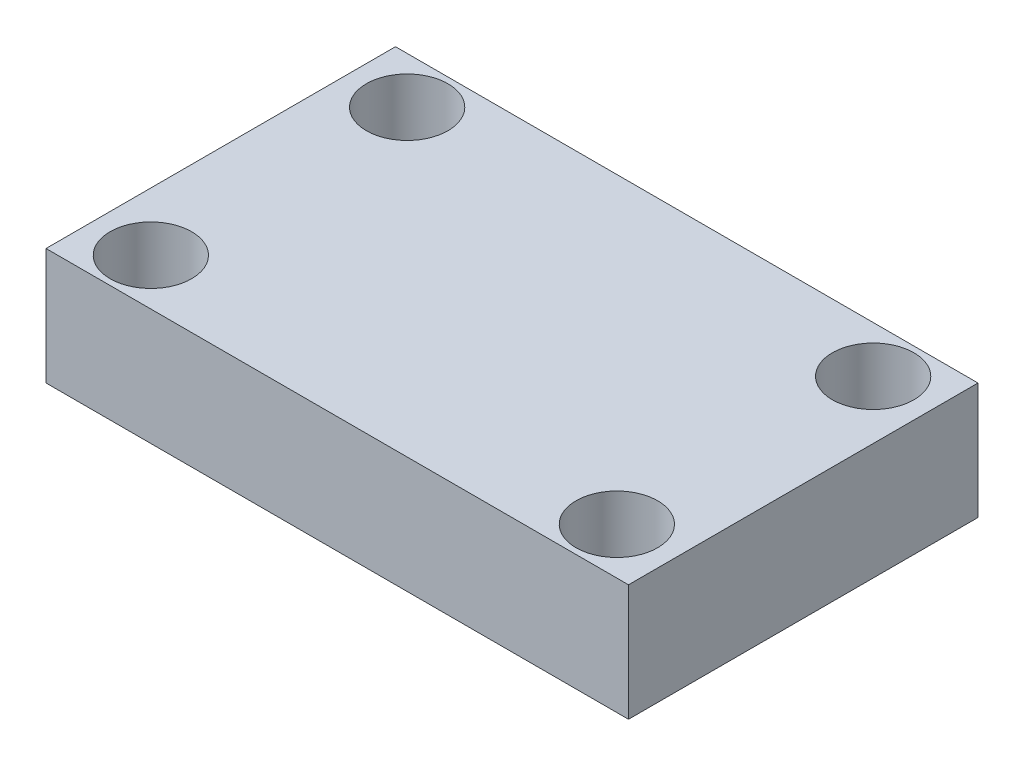
ISO-10303-21;
HEADER;
FILE_DESCRIPTION(('STEP AP214'),'2;1');
FILE_NAME('part.step','',(''),(''),'','','');
FILE_SCHEMA(('AUTOMOTIVE_DESIGN { 1 0 10303 214 1 1 1 1 }'));
ENDSEC;
DATA;
#1=APPLICATION_CONTEXT('core data for automotive mechanical design processes');
#2=APPLICATION_PROTOCOL_DEFINITION('international standard','automotive_design',2000,#1);
#3=PRODUCT_CONTEXT('',#1,'mechanical');
#4=PRODUCT('Part','Part','',(#3));
#5=PRODUCT_RELATED_PRODUCT_CATEGORY('part','',(#4));
#6=PRODUCT_DEFINITION_FORMATION('','',#4);
#7=PRODUCT_DEFINITION_CONTEXT('part definition',#1,'design');
#8=PRODUCT_DEFINITION('design','',#6,#7);
#9=PRODUCT_DEFINITION_SHAPE('','',#8);
#10=(LENGTH_UNIT() NAMED_UNIT(*) SI_UNIT(.MILLI.,.METRE.));
#11=(NAMED_UNIT(*) PLANE_ANGLE_UNIT() SI_UNIT($,.RADIAN.));
#12=(NAMED_UNIT(*) SI_UNIT($,.STERADIAN.) SOLID_ANGLE_UNIT());
#13=UNCERTAINTY_MEASURE_WITH_UNIT(LENGTH_MEASURE(1.E-05),#10,'distance_accuracy_value','');
#14=(GEOMETRIC_REPRESENTATION_CONTEXT(3) GLOBAL_UNCERTAINTY_ASSIGNED_CONTEXT((#13)) GLOBAL_UNIT_ASSIGNED_CONTEXT((#10,
#11,#12)) REPRESENTATION_CONTEXT('',''));
#15=CARTESIAN_POINT('',(0.,0.,0.));
#16=DIRECTION('',(0.,0.,1.));
#17=DIRECTION('',(1.,0.,0.));
#18=AXIS2_PLACEMENT_3D('',#15,#16,#17);
#19=CARTESIAN_POINT('',(-250.,100.,150.));
#20=DIRECTION('',(1.,0.,0.));
#21=DIRECTION('',(0.,0.,-1.));
#22=AXIS2_PLACEMENT_3D('',#19,#20,#21);
#23=PLANE('',#22);
#24=DIRECTION('',(0.,0.,1.));
#25=VECTOR('',#24,1.);
#26=CARTESIAN_POINT('',(-250.,0.,150.));
#27=LINE('',#26,#25);
#28=CARTESIAN_POINT('',(-250.,0.,-150.));
#29=VERTEX_POINT('',#28);
#30=CARTESIAN_POINT('',(-250.,0.,150.));
#31=VERTEX_POINT('',#30);
#32=EDGE_CURVE('E100',#29,#31,#27,.T.);
#33=ORIENTED_EDGE('',*,*,#32,.T.);
#34=DIRECTION('',(0.,-1.,0.));
#35=VECTOR('',#34,1.);
#36=CARTESIAN_POINT('',(-250.,100.,150.));
#37=LINE('',#36,#35);
#38=CARTESIAN_POINT('',(-250.,100.,150.));
#39=VERTEX_POINT('',#38);
#40=EDGE_CURVE('E11',#39,#31,#37,.T.);
#41=ORIENTED_EDGE('',*,*,#40,.F.);
#42=DIRECTION('',(0.,0.,1.));
#43=VECTOR('',#42,1.);
#44=CARTESIAN_POINT('',(-250.,100.,150.));
#45=LINE('',#44,#43);
#46=CARTESIAN_POINT('',(-250.,100.,-150.));
#47=VERTEX_POINT('',#46);
#48=EDGE_CURVE('E88',#47,#39,#45,.T.);
#49=ORIENTED_EDGE('',*,*,#48,.F.);
#50=DIRECTION('',(0.,-1.,0.));
#51=VECTOR('',#50,1.);
#52=CARTESIAN_POINT('',(-250.,100.,-150.));
#53=LINE('',#52,#51);
#54=EDGE_CURVE('E96',#47,#29,#53,.T.);
#55=ORIENTED_EDGE('',*,*,#54,.T.);
#56=EDGE_LOOP('',(#33,#41,#49,#55));
#57=FACE_BOUND('',#56,.T.);
#58=ADVANCED_FACE('F37',(#57),#23,.F.);
#59=CARTESIAN_POINT('',(250.,100.,150.));
#60=DIRECTION('',(0.,0.,-1.));
#61=DIRECTION('',(-1.,0.,0.));
#62=AXIS2_PLACEMENT_3D('',#59,#60,#61);
#63=PLANE('',#62);
#64=DIRECTION('',(1.,0.,0.));
#65=VECTOR('',#64,1.);
#66=CARTESIAN_POINT('',(250.,0.,150.));
#67=LINE('',#66,#65);
#68=CARTESIAN_POINT('',(250.,0.,150.));
#69=VERTEX_POINT('',#68);
#70=EDGE_CURVE('E92',#31,#69,#67,.T.);
#71=ORIENTED_EDGE('',*,*,#70,.T.);
#72=DIRECTION('',(0.,-1.,0.));
#73=VECTOR('',#72,1.);
#74=CARTESIAN_POINT('',(250.,100.,150.));
#75=LINE('',#74,#73);
#76=CARTESIAN_POINT('',(250.,100.,150.));
#77=VERTEX_POINT('',#76);
#78=EDGE_CURVE('E45',#77,#69,#75,.T.);
#79=ORIENTED_EDGE('',*,*,#78,.F.);
#80=DIRECTION('',(1.,0.,0.));
#81=VECTOR('',#80,1.);
#82=CARTESIAN_POINT('',(250.,100.,150.));
#83=LINE('',#82,#81);
#84=EDGE_CURVE('E83',#39,#77,#83,.T.);
#85=ORIENTED_EDGE('',*,*,#84,.F.);
#86=ORIENTED_EDGE('',*,*,#40,.T.);
#87=EDGE_LOOP('',(#71,#79,#85,#86));
#88=FACE_BOUND('',#87,.T.);
#89=ADVANCED_FACE('F91',(#88),#63,.F.);
#90=CARTESIAN_POINT('',(250.,100.,150.));
#91=DIRECTION('',(-1.,0.,0.));
#92=DIRECTION('',(0.,0.,1.));
#93=AXIS2_PLACEMENT_3D('',#90,#91,#92);
#94=PLANE('',#93);
#95=DIRECTION('',(0.,0.,-1.));
#96=VECTOR('',#95,1.);
#97=CARTESIAN_POINT('',(250.,0.,150.));
#98=LINE('',#97,#96);
#99=CARTESIAN_POINT('',(250.,0.,-150.));
#100=VERTEX_POINT('',#99);
#101=EDGE_CURVE('E70',#69,#100,#98,.T.);
#102=ORIENTED_EDGE('',*,*,#101,.T.);
#103=DIRECTION('',(0.,-1.,0.));
#104=VECTOR('',#103,1.);
#105=CARTESIAN_POINT('',(250.,100.,-150.));
#106=LINE('',#105,#104);
#107=CARTESIAN_POINT('',(250.,100.,-150.));
#108=VERTEX_POINT('',#107);
#109=EDGE_CURVE('E93',#108,#100,#106,.T.);
#110=ORIENTED_EDGE('',*,*,#109,.F.);
#111=DIRECTION('',(0.,0.,-1.));
#112=VECTOR('',#111,1.);
#113=CARTESIAN_POINT('',(250.,100.,150.));
#114=LINE('',#113,#112);
#115=EDGE_CURVE('E86',#77,#108,#114,.T.);
#116=ORIENTED_EDGE('',*,*,#115,.F.);
#117=ORIENTED_EDGE('',*,*,#78,.T.);
#118=EDGE_LOOP('',(#102,#110,#116,#117));
#119=FACE_BOUND('',#118,.T.);
#120=ADVANCED_FACE('F94',(#119),#94,.F.);
#121=CARTESIAN_POINT('',(250.,100.,-150.));
#122=DIRECTION('',(0.,0.,1.));
#123=DIRECTION('',(1.,0.,0.));
#124=AXIS2_PLACEMENT_3D('',#121,#122,#123);
#125=PLANE('',#124);
#126=DIRECTION('',(-1.,0.,0.));
#127=VECTOR('',#126,1.);
#128=CARTESIAN_POINT('',(250.,0.,-150.));
#129=LINE('',#128,#127);
#130=EDGE_CURVE('E76',#100,#29,#129,.T.);
#131=ORIENTED_EDGE('',*,*,#130,.T.);
#132=ORIENTED_EDGE('',*,*,#54,.F.);
#133=DIRECTION('',(-1.,0.,0.));
#134=VECTOR('',#133,1.);
#135=CARTESIAN_POINT('',(250.,100.,-150.));
#136=LINE('',#135,#134);
#137=EDGE_CURVE('E53',#108,#47,#136,.T.);
#138=ORIENTED_EDGE('',*,*,#137,.F.);
#139=ORIENTED_EDGE('',*,*,#109,.T.);
#140=EDGE_LOOP('',(#131,#132,#138,#139));
#141=FACE_BOUND('',#140,.T.);
#142=ADVANCED_FACE('F108',(#141),#125,.F.);
#143=CARTESIAN_POINT('',(0.,100.,0.));
#144=DIRECTION('',(0.,1.,0.));
#145=DIRECTION('',(0.,0.,1.));
#146=AXIS2_PLACEMENT_3D('',#143,#144,#145);
#147=PLANE('',#146);
#148=CARTESIAN_POINT('',(-200.,100.,110.));
#149=DIRECTION('',(0.,1.,0.));
#150=DIRECTION('',(0.,0.,1.));
#151=AXIS2_PLACEMENT_3D('',#148,#149,#150);
#152=CIRCLE('',#151,35.);
#153=CARTESIAN_POINT('',(-200.,100.,145.));
#154=VERTEX_POINT('',#153);
#155=EDGE_CURVE('E120',#154,#154,#152,.T.);
#156=ORIENTED_EDGE('',*,*,#155,.F.);
#157=EDGE_LOOP('',(#156));
#158=FACE_BOUND('',#157,.T.);
#159=CARTESIAN_POINT('',(200.,100.,110.));
#160=DIRECTION('',(0.,1.,0.));
#161=DIRECTION('',(0.,0.,1.));
#162=AXIS2_PLACEMENT_3D('',#159,#160,#161);
#163=CIRCLE('',#162,35.);
#164=CARTESIAN_POINT('',(200.,100.,145.));
#165=VERTEX_POINT('',#164);
#166=EDGE_CURVE('E126',#165,#165,#163,.T.);
#167=ORIENTED_EDGE('',*,*,#166,.F.);
#168=EDGE_LOOP('',(#167));
#169=FACE_BOUND('',#168,.T.);
#170=CARTESIAN_POINT('',(200.,100.,-110.));
#171=DIRECTION('',(0.,1.,0.));
#172=DIRECTION('',(0.,0.,1.));
#173=AXIS2_PLACEMENT_3D('',#170,#171,#172);
#174=CIRCLE('',#173,35.);
#175=CARTESIAN_POINT('',(200.,100.,-75.));
#176=VERTEX_POINT('',#175);
#177=EDGE_CURVE('E132',#176,#176,#174,.T.);
#178=ORIENTED_EDGE('',*,*,#177,.F.);
#179=EDGE_LOOP('',(#178));
#180=FACE_BOUND('',#179,.T.);
#181=CARTESIAN_POINT('',(-200.,100.,-110.));
#182=DIRECTION('',(0.,1.,0.));
#183=DIRECTION('',(0.,0.,1.));
#184=AXIS2_PLACEMENT_3D('',#181,#182,#183);
#185=CIRCLE('',#184,35.);
#186=CARTESIAN_POINT('',(-200.,100.,-75.));
#187=VERTEX_POINT('',#186);
#188=EDGE_CURVE('E103',#187,#187,#185,.T.);
#189=ORIENTED_EDGE('',*,*,#188,.F.);
#190=EDGE_LOOP('',(#189));
#191=FACE_BOUND('',#190,.T.);
#192=ORIENTED_EDGE('',*,*,#48,.T.);
#193=ORIENTED_EDGE('',*,*,#84,.T.);
#194=ORIENTED_EDGE('',*,*,#115,.T.);
#195=ORIENTED_EDGE('',*,*,#137,.T.);
#196=EDGE_LOOP('',(#192,#193,#194,#195));
#197=FACE_BOUND('',#196,.T.);
#198=ADVANCED_FACE('F84',(#158,#169,#180,#191,#197),#147,.T.);
#199=CARTESIAN_POINT('',(0.,0.,0.));
#200=DIRECTION('',(0.,1.,0.));
#201=DIRECTION('',(0.,0.,1.));
#202=AXIS2_PLACEMENT_3D('',#199,#200,#201);
#203=PLANE('',#202);
#204=CARTESIAN_POINT('',(-200.,0.,110.));
#205=DIRECTION('',(0.,1.,0.));
#206=DIRECTION('',(0.,0.,1.));
#207=AXIS2_PLACEMENT_3D('',#204,#205,#206);
#208=CIRCLE('',#207,35.);
#209=CARTESIAN_POINT('',(-200.,0.,145.));
#210=VERTEX_POINT('',#209);
#211=EDGE_CURVE('E123',#210,#210,#208,.T.);
#212=ORIENTED_EDGE('',*,*,#211,.T.);
#213=EDGE_LOOP('',(#212));
#214=FACE_BOUND('',#213,.T.);
#215=CARTESIAN_POINT('',(200.,0.,110.));
#216=DIRECTION('',(0.,1.,0.));
#217=DIRECTION('',(0.,0.,1.));
#218=AXIS2_PLACEMENT_3D('',#215,#216,#217);
#219=CIRCLE('',#218,35.);
#220=CARTESIAN_POINT('',(200.,0.,145.));
#221=VERTEX_POINT('',#220);
#222=EDGE_CURVE('E129',#221,#221,#219,.T.);
#223=ORIENTED_EDGE('',*,*,#222,.T.);
#224=EDGE_LOOP('',(#223));
#225=FACE_BOUND('',#224,.T.);
#226=CARTESIAN_POINT('',(200.,0.,-110.));
#227=DIRECTION('',(0.,1.,0.));
#228=DIRECTION('',(0.,0.,1.));
#229=AXIS2_PLACEMENT_3D('',#226,#227,#228);
#230=CIRCLE('',#229,35.);
#231=CARTESIAN_POINT('',(200.,0.,-75.));
#232=VERTEX_POINT('',#231);
#233=EDGE_CURVE('E117',#232,#232,#230,.T.);
#234=ORIENTED_EDGE('',*,*,#233,.T.);
#235=EDGE_LOOP('',(#234));
#236=FACE_BOUND('',#235,.T.);
#237=CARTESIAN_POINT('',(-200.,0.,-110.));
#238=DIRECTION('',(0.,1.,0.));
#239=DIRECTION('',(0.,0.,1.));
#240=AXIS2_PLACEMENT_3D('',#237,#238,#239);
#241=CIRCLE('',#240,35.);
#242=CARTESIAN_POINT('',(-200.,0.,-75.));
#243=VERTEX_POINT('',#242);
#244=EDGE_CURVE('E114',#243,#243,#241,.T.);
#245=ORIENTED_EDGE('',*,*,#244,.T.);
#246=EDGE_LOOP('',(#245));
#247=FACE_BOUND('',#246,.T.);
#248=ORIENTED_EDGE('',*,*,#32,.F.);
#249=ORIENTED_EDGE('',*,*,#130,.F.);
#250=ORIENTED_EDGE('',*,*,#101,.F.);
#251=ORIENTED_EDGE('',*,*,#70,.F.);
#252=EDGE_LOOP('',(#248,#249,#250,#251));
#253=FACE_BOUND('',#252,.T.);
#254=ADVANCED_FACE('F111',(#214,#225,#236,#247,#253),#203,.F.);
#255=CARTESIAN_POINT('',(-200.,100.,-110.));
#256=DIRECTION('',(0.,-1.,0.));
#257=DIRECTION('',(0.,0.,-1.));
#258=AXIS2_PLACEMENT_3D('',#255,#256,#257);
#259=CYLINDRICAL_SURFACE('',#258,35.);
#260=ORIENTED_EDGE('',*,*,#188,.T.);
#261=EDGE_LOOP('',(#260));
#262=FACE_BOUND('',#261,.T.);
#263=ORIENTED_EDGE('',*,*,#244,.F.);
#264=EDGE_LOOP('',(#263));
#265=FACE_BOUND('',#264,.T.);
#266=ADVANCED_FACE('F143',(#262,#265),#259,.F.);
#267=CARTESIAN_POINT('',(200.,100.,-110.));
#268=DIRECTION('',(0.,-1.,0.));
#269=DIRECTION('',(0.,0.,-1.));
#270=AXIS2_PLACEMENT_3D('',#267,#268,#269);
#271=CYLINDRICAL_SURFACE('',#270,35.);
#272=ORIENTED_EDGE('',*,*,#177,.T.);
#273=EDGE_LOOP('',(#272));
#274=FACE_BOUND('',#273,.T.);
#275=ORIENTED_EDGE('',*,*,#233,.F.);
#276=EDGE_LOOP('',(#275));
#277=FACE_BOUND('',#276,.T.);
#278=ADVANCED_FACE('F140',(#274,#277),#271,.F.);
#279=CARTESIAN_POINT('',(200.,100.,110.));
#280=DIRECTION('',(0.,-1.,0.));
#281=DIRECTION('',(0.,0.,-1.));
#282=AXIS2_PLACEMENT_3D('',#279,#280,#281);
#283=CYLINDRICAL_SURFACE('',#282,35.);
#284=ORIENTED_EDGE('',*,*,#166,.T.);
#285=EDGE_LOOP('',(#284));
#286=FACE_BOUND('',#285,.T.);
#287=ORIENTED_EDGE('',*,*,#222,.F.);
#288=EDGE_LOOP('',(#287));
#289=FACE_BOUND('',#288,.T.);
#290=ADVANCED_FACE('F142',(#286,#289),#283,.F.);
#291=CARTESIAN_POINT('',(-200.,100.,110.));
#292=DIRECTION('',(0.,-1.,0.));
#293=DIRECTION('',(0.,0.,-1.));
#294=AXIS2_PLACEMENT_3D('',#291,#292,#293);
#295=CYLINDRICAL_SURFACE('',#294,35.);
#296=ORIENTED_EDGE('',*,*,#155,.T.);
#297=EDGE_LOOP('',(#296));
#298=FACE_BOUND('',#297,.T.);
#299=ORIENTED_EDGE('',*,*,#211,.F.);
#300=EDGE_LOOP('',(#299));
#301=FACE_BOUND('',#300,.T.);
#302=ADVANCED_FACE('F150',(#298,#301),#295,.F.);
#303=CLOSED_SHELL('',(#58,#89,#120,#142,#198,#254,#266,#278,#290,#302));
#304=MANIFOLD_SOLID_BREP('B2',#303);
#305=ADVANCED_BREP_SHAPE_REPRESENTATION('',(#18,#304),#14);
#306=SHAPE_DEFINITION_REPRESENTATION(#9,#305);
ENDSEC;
END-ISO-10303-21;
